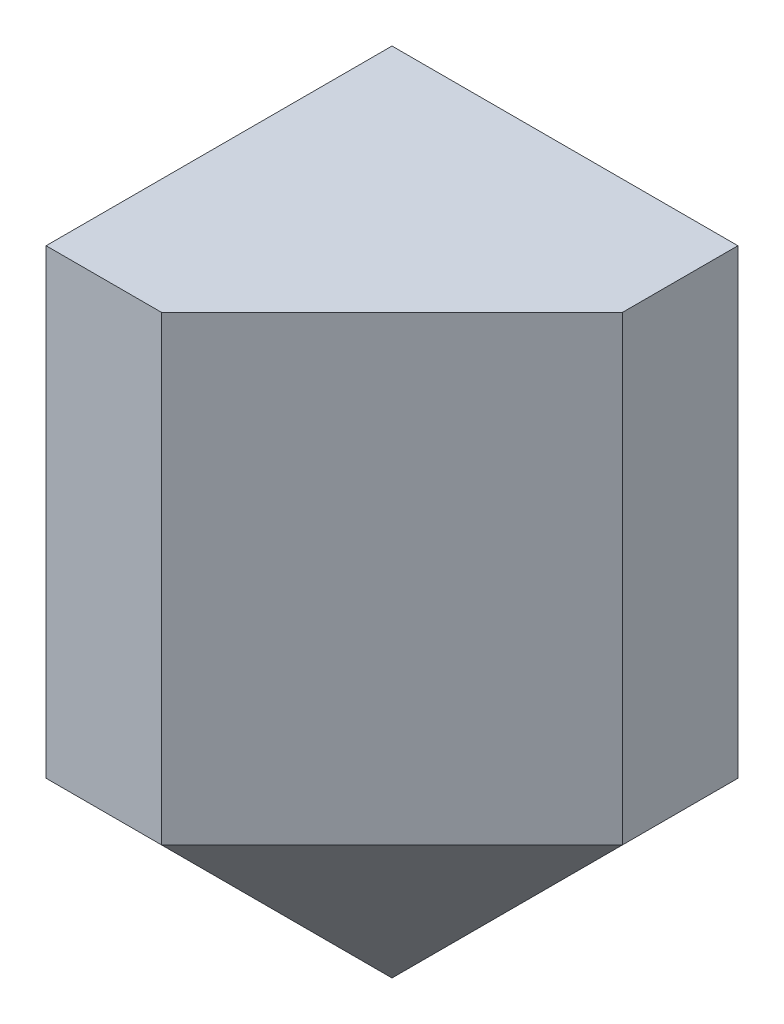
ISO-10303-21;
HEADER;
FILE_DESCRIPTION(('STEP AP214'),'2;1');
FILE_NAME('part.step','',(''),(''),'','','');
FILE_SCHEMA(('AUTOMOTIVE_DESIGN { 1 0 10303 214 1 1 1 1 }'));
ENDSEC;
DATA;
#1=APPLICATION_CONTEXT('core data for automotive mechanical design processes');
#2=APPLICATION_PROTOCOL_DEFINITION('international standard','automotive_design',2000,#1);
#3=PRODUCT_CONTEXT('',#1,'mechanical');
#4=PRODUCT('Part','Part','',(#3));
#5=PRODUCT_RELATED_PRODUCT_CATEGORY('part','',(#4));
#6=PRODUCT_DEFINITION_FORMATION('','',#4);
#7=PRODUCT_DEFINITION_CONTEXT('part definition',#1,'design');
#8=PRODUCT_DEFINITION('design','',#6,#7);
#9=PRODUCT_DEFINITION_SHAPE('','',#8);
#10=(LENGTH_UNIT() NAMED_UNIT(*) SI_UNIT(.MILLI.,.METRE.));
#11=(NAMED_UNIT(*) PLANE_ANGLE_UNIT() SI_UNIT($,.RADIAN.));
#12=(NAMED_UNIT(*) SI_UNIT($,.STERADIAN.) SOLID_ANGLE_UNIT());
#13=UNCERTAINTY_MEASURE_WITH_UNIT(LENGTH_MEASURE(1.E-05),#10,'distance_accuracy_value','');
#14=(GEOMETRIC_REPRESENTATION_CONTEXT(3) GLOBAL_UNCERTAINTY_ASSIGNED_CONTEXT((#13)) GLOBAL_UNIT_ASSIGNED_CONTEXT((#10,
#11,#12)) REPRESENTATION_CONTEXT('',''));
#15=CARTESIAN_POINT('',(0.,0.,0.));
#16=DIRECTION('',(0.,0.,1.));
#17=DIRECTION('',(1.,0.,0.));
#18=AXIS2_PLACEMENT_3D('',#15,#16,#17);
#19=CARTESIAN_POINT('',(0.,0.,30.));
#20=DIRECTION('',(1.,0.,0.));
#21=DIRECTION('',(0.,0.,-1.));
#22=AXIS2_PLACEMENT_3D('',#19,#20,#21);
#23=PLANE('',#22);
#24=CARTESIAN_POINT('',(0.,20.,18.));
#25=DIRECTION('',(-1.,0.,0.));
#26=DIRECTION('',(0.,0.,1.));
#27=AXIS2_PLACEMENT_3D('',#24,#25,#26);
#28=CIRCLE('',#27,2.75);
#29=CARTESIAN_POINT('',(0.,20.,20.75));
#30=VERTEX_POINT('',#29);
#31=EDGE_CURVE('E126',#30,#30,#28,.T.);
#32=ORIENTED_EDGE('',*,*,#31,.F.);
#33=EDGE_LOOP('',(#32));
#34=FACE_BOUND('',#33,.T.);
#35=CARTESIAN_POINT('',(0.,48.,18.));
#36=DIRECTION('',(-1.,0.,0.));
#37=DIRECTION('',(0.,0.,1.));
#38=AXIS2_PLACEMENT_3D('',#35,#36,#37);
#39=CIRCLE('',#38,2.75);
#40=CARTESIAN_POINT('',(0.,48.,20.75));
#41=VERTEX_POINT('',#40);
#42=EDGE_CURVE('E132',#41,#41,#39,.T.);
#43=ORIENTED_EDGE('',*,*,#42,.F.);
#44=EDGE_LOOP('',(#43));
#45=FACE_BOUND('',#44,.T.);
#46=DIRECTION('',(0.,0.,-1.));
#47=VECTOR('',#46,1.);
#48=CARTESIAN_POINT('',(0.,0.,30.));
#49=LINE('',#48,#47);
#50=CARTESIAN_POINT('',(0.,0.,9.99999999999995));
#51=VERTEX_POINT('',#50);
#52=CARTESIAN_POINT('',(0.,0.,0.));
#53=VERTEX_POINT('',#52);
#54=EDGE_CURVE('E157',#51,#53,#49,.T.);
#55=ORIENTED_EDGE('',*,*,#54,.F.);
#56=DIRECTION('',(0.,-0.707106781186546,-0.707106781186549));
#57=VECTOR('',#56,1.);
#58=CARTESIAN_POINT('',(0.,20.,30.));
#59=LINE('',#58,#57);
#60=CARTESIAN_POINT('',(0.,20.,30.));
#61=VERTEX_POINT('',#60);
#62=EDGE_CURVE('E11',#51,#61,#59,.F.);
#63=ORIENTED_EDGE('',*,*,#62,.T.);
#64=DIRECTION('',(0.,-1.,0.));
#65=VECTOR('',#64,1.);
#66=CARTESIAN_POINT('',(0.,0.,30.));
#67=LINE('',#66,#65);
#68=CARTESIAN_POINT('',(0.,60.,30.));
#69=VERTEX_POINT('',#68);
#70=EDGE_CURVE('E154',#69,#61,#67,.T.);
#71=ORIENTED_EDGE('',*,*,#70,.F.);
#72=DIRECTION('',(0.,0.,1.));
#73=VECTOR('',#72,1.);
#74=CARTESIAN_POINT('',(0.,60.,30.));
#75=LINE('',#74,#73);
#76=CARTESIAN_POINT('',(0.,60.,0.));
#77=VERTEX_POINT('',#76);
#78=EDGE_CURVE('E138',#77,#69,#75,.T.);
#79=ORIENTED_EDGE('',*,*,#78,.F.);
#80=DIRECTION('',(0.,-1.,0.));
#81=VECTOR('',#80,1.);
#82=CARTESIAN_POINT('',(0.,0.,0.));
#83=LINE('',#82,#81);
#84=EDGE_CURVE('E159',#77,#53,#83,.T.);
#85=ORIENTED_EDGE('',*,*,#84,.T.);
#86=EDGE_LOOP('',(#55,#63,#71,#79,#85));
#87=FACE_BOUND('',#86,.T.);
#88=ADVANCED_FACE('F39',(#34,#45,#87),#23,.F.);
#89=CARTESIAN_POINT('',(0.,0.,30.));
#90=DIRECTION('',(0.,1.,0.));
#91=DIRECTION('',(0.,0.,1.));
#92=AXIS2_PLACEMENT_3D('',#89,#90,#91);
#93=PLANE('',#92);
#94=DIRECTION('',(1.,0.,0.));
#95=VECTOR('',#94,1.);
#96=CARTESIAN_POINT('',(0.,0.,0.));
#97=LINE('',#96,#95);
#98=CARTESIAN_POINT('',(9.99999999999995,0.,0.));
#99=VERTEX_POINT('',#98);
#100=EDGE_CURVE('E162',#53,#99,#97,.T.);
#101=ORIENTED_EDGE('',*,*,#100,.T.);
#102=DIRECTION('',(0.,0.,1.));
#103=VECTOR('',#102,1.);
#104=CARTESIAN_POINT('',(9.99999999999995,0.,30.));
#105=LINE('',#104,#103);
#106=CARTESIAN_POINT('',(9.99999999999995,0.,9.99999999999995));
#107=VERTEX_POINT('',#106);
#108=EDGE_CURVE('E49',#99,#107,#105,.T.);
#109=ORIENTED_EDGE('',*,*,#108,.T.);
#110=DIRECTION('',(-1.,0.,0.));
#111=VECTOR('',#110,1.);
#112=CARTESIAN_POINT('',(0.,0.,9.99999999999995));
#113=LINE('',#112,#111);
#114=EDGE_CURVE('E60',#107,#51,#113,.T.);
#115=ORIENTED_EDGE('',*,*,#114,.T.);
#116=ORIENTED_EDGE('',*,*,#54,.T.);
#117=EDGE_LOOP('',(#101,#109,#115,#116));
#118=FACE_BOUND('',#117,.T.);
#119=ADVANCED_FACE('F215',(#118),#93,.F.);
#120=CARTESIAN_POINT('',(30.,0.,30.));
#121=DIRECTION('',(-1.,0.,0.));
#122=DIRECTION('',(0.,0.,1.));
#123=AXIS2_PLACEMENT_3D('',#120,#121,#122);
#124=PLANE('',#123);
#125=DIRECTION('',(0.,1.,0.));
#126=VECTOR('',#125,1.);
#127=CARTESIAN_POINT('',(30.,0.,0.));
#128=LINE('',#127,#126);
#129=CARTESIAN_POINT('',(30.,20.,0.));
#130=VERTEX_POINT('',#129);
#131=CARTESIAN_POINT('',(30.,60.,0.));
#132=VERTEX_POINT('',#131);
#133=EDGE_CURVE('E158',#130,#132,#128,.T.);
#134=ORIENTED_EDGE('',*,*,#133,.T.);
#135=DIRECTION('',(0.,0.,-1.));
#136=VECTOR('',#135,1.);
#137=CARTESIAN_POINT('',(30.,60.,0.));
#138=LINE('',#137,#136);
#139=CARTESIAN_POINT('',(30.,60.,9.99999999999992));
#140=VERTEX_POINT('',#139);
#141=EDGE_CURVE('E147',#140,#132,#138,.T.);
#142=ORIENTED_EDGE('',*,*,#141,.F.);
#143=DIRECTION('',(0.,-1.,0.));
#144=VECTOR('',#143,1.);
#145=CARTESIAN_POINT('',(30.,0.,9.99999999999995));
#146=LINE('',#145,#144);
#147=CARTESIAN_POINT('',(30.,20.,9.99999999999995));
#148=VERTEX_POINT('',#147);
#149=EDGE_CURVE('E172',#140,#148,#146,.T.);
#150=ORIENTED_EDGE('',*,*,#149,.T.);
#151=DIRECTION('',(0.,0.,-1.));
#152=VECTOR('',#151,1.);
#153=CARTESIAN_POINT('',(30.,20.,30.));
#154=LINE('',#153,#152);
#155=EDGE_CURVE('E170',#148,#130,#154,.T.);
#156=ORIENTED_EDGE('',*,*,#155,.T.);
#157=EDGE_LOOP('',(#134,#142,#150,#156));
#158=FACE_BOUND('',#157,.T.);
#159=ADVANCED_FACE('F221',(#158),#124,.F.);
#160=CARTESIAN_POINT('',(0.,0.,30.));
#161=DIRECTION('',(0.,0.,-1.));
#162=DIRECTION('',(-1.,0.,0.));
#163=AXIS2_PLACEMENT_3D('',#160,#161,#162);
#164=PLANE('',#163);
#165=DIRECTION('',(1.,0.,0.));
#166=VECTOR('',#165,1.);
#167=CARTESIAN_POINT('',(0.,20.,30.));
#168=LINE('',#167,#166);
#169=CARTESIAN_POINT('',(10.,20.,30.));
#170=VERTEX_POINT('',#169);
#171=EDGE_CURVE('E166',#61,#170,#168,.T.);
#172=ORIENTED_EDGE('',*,*,#171,.T.);
#173=DIRECTION('',(0.,1.,0.));
#174=VECTOR('',#173,1.);
#175=CARTESIAN_POINT('',(10.,0.,30.));
#176=LINE('',#175,#174);
#177=CARTESIAN_POINT('',(9.99999999999999,60.,30.));
#178=VERTEX_POINT('',#177);
#179=EDGE_CURVE('E168',#170,#178,#176,.T.);
#180=ORIENTED_EDGE('',*,*,#179,.T.);
#181=DIRECTION('',(1.,0.,0.));
#182=VECTOR('',#181,1.);
#183=CARTESIAN_POINT('',(9.99999999999999,60.,30.));
#184=LINE('',#183,#182);
#185=EDGE_CURVE('E141',#69,#178,#184,.T.);
#186=ORIENTED_EDGE('',*,*,#185,.F.);
#187=ORIENTED_EDGE('',*,*,#70,.T.);
#188=EDGE_LOOP('',(#172,#180,#186,#187));
#189=FACE_BOUND('',#188,.T.);
#190=ADVANCED_FACE('F195',(#189),#164,.F.);
#191=CARTESIAN_POINT('',(0.,0.,0.));
#192=DIRECTION('',(0.,0.,-1.));
#193=DIRECTION('',(-1.,0.,0.));
#194=AXIS2_PLACEMENT_3D('',#191,#192,#193);
#195=PLANE('',#194);
#196=CARTESIAN_POINT('',(18.,20.,0.));
#197=DIRECTION('',(0.,0.,-1.));
#198=DIRECTION('',(-1.,0.,0.));
#199=AXIS2_PLACEMENT_3D('',#196,#197,#198);
#200=CIRCLE('',#199,2.74999999999999);
#201=CARTESIAN_POINT('',(15.25,20.,0.));
#202=VERTEX_POINT('',#201);
#203=EDGE_CURVE('E116',#202,#202,#200,.T.);
#204=ORIENTED_EDGE('',*,*,#203,.F.);
#205=EDGE_LOOP('',(#204));
#206=FACE_BOUND('',#205,.T.);
#207=CARTESIAN_POINT('',(18.,48.,0.));
#208=DIRECTION('',(0.,0.,-1.));
#209=DIRECTION('',(-1.,0.,0.));
#210=AXIS2_PLACEMENT_3D('',#207,#208,#209);
#211=CIRCLE('',#210,2.74999999999999);
#212=CARTESIAN_POINT('',(15.25,48.,0.));
#213=VERTEX_POINT('',#212);
#214=EDGE_CURVE('E115',#213,#213,#211,.T.);
#215=ORIENTED_EDGE('',*,*,#214,.F.);
#216=EDGE_LOOP('',(#215));
#217=FACE_BOUND('',#216,.T.);
#218=ORIENTED_EDGE('',*,*,#133,.F.);
#219=DIRECTION('',(0.707106781186549,0.707106781186546,0.));
#220=VECTOR('',#219,1.);
#221=CARTESIAN_POINT('',(4.99999999999996,-4.99999999999997,0.));
#222=LINE('',#221,#220);
#223=EDGE_CURVE('E174',#130,#99,#222,.F.);
#224=ORIENTED_EDGE('',*,*,#223,.T.);
#225=ORIENTED_EDGE('',*,*,#100,.F.);
#226=ORIENTED_EDGE('',*,*,#84,.F.);
#227=DIRECTION('',(-1.,0.,0.));
#228=VECTOR('',#227,1.);
#229=CARTESIAN_POINT('',(0.,60.,0.));
#230=LINE('',#229,#228);
#231=EDGE_CURVE('E150',#132,#77,#230,.T.);
#232=ORIENTED_EDGE('',*,*,#231,.F.);
#233=EDGE_LOOP('',(#218,#224,#225,#226,#232));
#234=FACE_BOUND('',#233,.T.);
#235=ADVANCED_FACE('F212',(#206,#217,#234),#195,.T.);
#236=CARTESIAN_POINT('',(30.,20.,30.));
#237=DIRECTION('',(-0.707106781186546,0.707106781186549,0.));
#238=DIRECTION('',(0.,0.,-1.));
#239=AXIS2_PLACEMENT_3D('',#236,#237,#238);
#240=PLANE('',#239);
#241=ORIENTED_EDGE('',*,*,#223,.F.);
#242=ORIENTED_EDGE('',*,*,#155,.F.);
#243=DIRECTION('',(-0.707106781186549,-0.707106781186546,0.));
#244=VECTOR('',#243,1.);
#245=CARTESIAN_POINT('',(30.,20.,9.99999999999995));
#246=LINE('',#245,#244);
#247=EDGE_CURVE('E44',#107,#148,#246,.F.);
#248=ORIENTED_EDGE('',*,*,#247,.F.);
#249=ORIENTED_EDGE('',*,*,#108,.F.);
#250=EDGE_LOOP('',(#241,#242,#248,#249));
#251=FACE_BOUND('',#250,.T.);
#252=ADVANCED_FACE('F42',(#251),#240,.F.);
#253=CARTESIAN_POINT('',(0.,20.,30.));
#254=DIRECTION('',(0.,0.707106781186549,-0.707106781186546));
#255=DIRECTION('',(1.,0.,0.));
#256=AXIS2_PLACEMENT_3D('',#253,#254,#255);
#257=PLANE('',#256);
#258=ORIENTED_EDGE('',*,*,#62,.F.);
#259=ORIENTED_EDGE('',*,*,#114,.F.);
#260=DIRECTION('',(0.,0.707106781186546,0.707106781186549));
#261=VECTOR('',#260,1.);
#262=CARTESIAN_POINT('',(9.99999999999998,10.,20.));
#263=LINE('',#262,#261);
#264=EDGE_CURVE('E179',#170,#107,#263,.F.);
#265=ORIENTED_EDGE('',*,*,#264,.F.);
#266=ORIENTED_EDGE('',*,*,#171,.F.);
#267=EDGE_LOOP('',(#258,#259,#265,#266));
#268=FACE_BOUND('',#267,.T.);
#269=ADVANCED_FACE('F205',(#268),#257,.F.);
#270=CARTESIAN_POINT('',(30.,20.,9.99999999999995));
#271=DIRECTION('',(0.577350269189626,-0.577350269189628,0.577350269189624));
#272=DIRECTION('',(0.707106781186549,0.707106781186546,0.));
#273=AXIS2_PLACEMENT_3D('',#270,#271,#272);
#274=PLANE('',#273);
#275=ORIENTED_EDGE('',*,*,#264,.T.);
#276=ORIENTED_EDGE('',*,*,#247,.T.);
#277=DIRECTION('',(0.707106781186546,0.,-0.707106781186549));
#278=VECTOR('',#277,1.);
#279=CARTESIAN_POINT('',(30.,20.,9.99999999999995));
#280=LINE('',#279,#278);
#281=EDGE_CURVE('E153',#170,#148,#280,.T.);
#282=ORIENTED_EDGE('',*,*,#281,.F.);
#283=EDGE_LOOP('',(#275,#276,#282));
#284=FACE_BOUND('',#283,.T.);
#285=ADVANCED_FACE('F186',(#284),#274,.T.);
#286=CARTESIAN_POINT('',(10.,0.,30.));
#287=DIRECTION('',(-0.707106781186549,0.,-0.707106781186546));
#288=DIRECTION('',(0.,1.,0.));
#289=AXIS2_PLACEMENT_3D('',#286,#287,#288);
#290=PLANE('',#289);
#291=ORIENTED_EDGE('',*,*,#281,.T.);
#292=ORIENTED_EDGE('',*,*,#149,.F.);
#293=DIRECTION('',(0.707106781186546,0.,-0.707106781186549));
#294=VECTOR('',#293,1.);
#295=CARTESIAN_POINT('',(30.,60.,9.99999999999992));
#296=LINE('',#295,#294);
#297=EDGE_CURVE('E144',#178,#140,#296,.T.);
#298=ORIENTED_EDGE('',*,*,#297,.F.);
#299=ORIENTED_EDGE('',*,*,#179,.F.);
#300=EDGE_LOOP('',(#291,#292,#298,#299));
#301=FACE_BOUND('',#300,.T.);
#302=ADVANCED_FACE('F191',(#301),#290,.F.);
#303=CARTESIAN_POINT('',(0.,60.,0.));
#304=DIRECTION('',(0.,-1.,0.));
#305=DIRECTION('',(0.,0.,-1.));
#306=AXIS2_PLACEMENT_3D('',#303,#304,#305);
#307=PLANE('',#306);
#308=ORIENTED_EDGE('',*,*,#78,.T.);
#309=ORIENTED_EDGE('',*,*,#185,.T.);
#310=ORIENTED_EDGE('',*,*,#297,.T.);
#311=ORIENTED_EDGE('',*,*,#141,.T.);
#312=ORIENTED_EDGE('',*,*,#231,.T.);
#313=EDGE_LOOP('',(#308,#309,#310,#311,#312));
#314=FACE_BOUND('',#313,.T.);
#315=ADVANCED_FACE('F198',(#314),#307,.F.);
#316=CARTESIAN_POINT('',(15.,48.,18.));
#317=DIRECTION('',(-1.,0.,0.));
#318=DIRECTION('',(0.,0.,1.));
#319=AXIS2_PLACEMENT_3D('',#316,#317,#318);
#320=CONICAL_SURFACE('',#319,2.74999999999999,1.02974425867665);
#321=CARTESIAN_POINT('',(16.6523667023258,48.,18.));
#322=VERTEX_POINT('',#321);
#323=VERTEX_LOOP('',#322);
#324=FACE_BOUND('',#323,.T.);
#325=CARTESIAN_POINT('',(15.,48.,18.));
#326=DIRECTION('',(-1.,0.,0.));
#327=DIRECTION('',(0.,0.,1.));
#328=AXIS2_PLACEMENT_3D('',#325,#326,#327);
#329=CIRCLE('',#328,2.74999999999999);
#330=CARTESIAN_POINT('',(15.,48.,20.75));
#331=VERTEX_POINT('',#330);
#332=EDGE_CURVE('E135',#331,#331,#329,.T.);
#333=ORIENTED_EDGE('',*,*,#332,.T.);
#334=EDGE_LOOP('',(#333));
#335=FACE_BOUND('',#334,.T.);
#336=ADVANCED_FACE('F241',(#324,#335),#320,.F.);
#337=CARTESIAN_POINT('',(0.,48.,18.));
#338=DIRECTION('',(-1.,0.,0.));
#339=DIRECTION('',(0.,0.,1.));
#340=AXIS2_PLACEMENT_3D('',#337,#338,#339);
#341=CYLINDRICAL_SURFACE('',#340,2.74999999999999);
#342=ORIENTED_EDGE('',*,*,#332,.F.);
#343=EDGE_LOOP('',(#342));
#344=FACE_BOUND('',#343,.T.);
#345=ORIENTED_EDGE('',*,*,#42,.T.);
#346=EDGE_LOOP('',(#345));
#347=FACE_BOUND('',#346,.T.);
#348=ADVANCED_FACE('F246',(#344,#347),#341,.F.);
#349=CARTESIAN_POINT('',(15.,20.,18.));
#350=DIRECTION('',(-1.,0.,0.));
#351=DIRECTION('',(0.,0.,1.));
#352=AXIS2_PLACEMENT_3D('',#349,#350,#351);
#353=CONICAL_SURFACE('',#352,2.74999999999999,1.02974425867665);
#354=CARTESIAN_POINT('',(16.6523667023258,20.,18.));
#355=VERTEX_POINT('',#354);
#356=VERTEX_LOOP('',#355);
#357=FACE_BOUND('',#356,.T.);
#358=CARTESIAN_POINT('',(15.,20.,18.));
#359=DIRECTION('',(-1.,0.,0.));
#360=DIRECTION('',(0.,0.,1.));
#361=AXIS2_PLACEMENT_3D('',#358,#359,#360);
#362=CIRCLE('',#361,2.74999999999999);
#363=CARTESIAN_POINT('',(15.,20.,20.75));
#364=VERTEX_POINT('',#363);
#365=EDGE_CURVE('E129',#364,#364,#362,.T.);
#366=ORIENTED_EDGE('',*,*,#365,.T.);
#367=EDGE_LOOP('',(#366));
#368=FACE_BOUND('',#367,.T.);
#369=ADVANCED_FACE('F358',(#357,#368),#353,.F.);
#370=CARTESIAN_POINT('',(0.,20.,18.));
#371=DIRECTION('',(-1.,0.,0.));
#372=DIRECTION('',(0.,0.,1.));
#373=AXIS2_PLACEMENT_3D('',#370,#371,#372);
#374=CYLINDRICAL_SURFACE('',#373,2.74999999999999);
#375=ORIENTED_EDGE('',*,*,#365,.F.);
#376=EDGE_LOOP('',(#375));
#377=FACE_BOUND('',#376,.T.);
#378=ORIENTED_EDGE('',*,*,#31,.T.);
#379=EDGE_LOOP('',(#378));
#380=FACE_BOUND('',#379,.T.);
#381=ADVANCED_FACE('F367',(#377,#380),#374,.F.);
#382=CARTESIAN_POINT('',(18.,48.,15.));
#383=DIRECTION('',(0.,0.,-1.));
#384=DIRECTION('',(-1.,0.,0.));
#385=AXIS2_PLACEMENT_3D('',#382,#383,#384);
#386=CONICAL_SURFACE('',#385,2.74999999999999,1.02974425867665);
#387=CARTESIAN_POINT('',(18.,48.,16.6523667023258));
#388=VERTEX_POINT('',#387);
#389=VERTEX_LOOP('',#388);
#390=FACE_BOUND('',#389,.T.);
#391=CARTESIAN_POINT('',(18.,48.,15.));
#392=DIRECTION('',(0.,0.,-1.));
#393=DIRECTION('',(-1.,0.,0.));
#394=AXIS2_PLACEMENT_3D('',#391,#392,#393);
#395=CIRCLE('',#394,2.74999999999999);
#396=CARTESIAN_POINT('',(15.25,48.,15.));
#397=VERTEX_POINT('',#396);
#398=EDGE_CURVE('E119',#397,#397,#395,.T.);
#399=ORIENTED_EDGE('',*,*,#398,.T.);
#400=EDGE_LOOP('',(#399));
#401=FACE_BOUND('',#400,.T.);
#402=ADVANCED_FACE('F377',(#390,#401),#386,.F.);
#403=CARTESIAN_POINT('',(18.,48.,0.));
#404=DIRECTION('',(0.,0.,-1.));
#405=DIRECTION('',(-1.,0.,0.));
#406=AXIS2_PLACEMENT_3D('',#403,#404,#405);
#407=CYLINDRICAL_SURFACE('',#406,2.74999999999999);
#408=ORIENTED_EDGE('',*,*,#398,.F.);
#409=EDGE_LOOP('',(#408));
#410=FACE_BOUND('',#409,.T.);
#411=ORIENTED_EDGE('',*,*,#214,.T.);
#412=EDGE_LOOP('',(#411));
#413=FACE_BOUND('',#412,.T.);
#414=ADVANCED_FACE('F109',(#410,#413),#407,.F.);
#415=CARTESIAN_POINT('',(18.,20.,15.));
#416=DIRECTION('',(0.,0.,-1.));
#417=DIRECTION('',(-1.,0.,0.));
#418=AXIS2_PLACEMENT_3D('',#415,#416,#417);
#419=CONICAL_SURFACE('',#418,2.74999999999999,1.02974425867665);
#420=CARTESIAN_POINT('',(18.,20.,16.6523667023258));
#421=VERTEX_POINT('',#420);
#422=VERTEX_LOOP('',#421);
#423=FACE_BOUND('',#422,.T.);
#424=CARTESIAN_POINT('',(18.,20.,15.));
#425=DIRECTION('',(0.,0.,-1.));
#426=DIRECTION('',(-1.,0.,0.));
#427=AXIS2_PLACEMENT_3D('',#424,#425,#426);
#428=CIRCLE('',#427,2.74999999999999);
#429=CARTESIAN_POINT('',(15.25,20.,15.));
#430=VERTEX_POINT('',#429);
#431=EDGE_CURVE('E113',#430,#430,#428,.T.);
#432=ORIENTED_EDGE('',*,*,#431,.T.);
#433=EDGE_LOOP('',(#432));
#434=FACE_BOUND('',#433,.T.);
#435=ADVANCED_FACE('F105',(#423,#434),#419,.F.);
#436=CARTESIAN_POINT('',(18.,20.,0.));
#437=DIRECTION('',(0.,0.,-1.));
#438=DIRECTION('',(-1.,0.,0.));
#439=AXIS2_PLACEMENT_3D('',#436,#437,#438);
#440=CYLINDRICAL_SURFACE('',#439,2.74999999999999);
#441=ORIENTED_EDGE('',*,*,#431,.F.);
#442=EDGE_LOOP('',(#441));
#443=FACE_BOUND('',#442,.T.);
#444=ORIENTED_EDGE('',*,*,#203,.T.);
#445=EDGE_LOOP('',(#444));
#446=FACE_BOUND('',#445,.T.);
#447=ADVANCED_FACE('F108',(#443,#446),#440,.F.);
#448=CLOSED_SHELL('',(#88,#119,#159,#190,#235,#252,#269,#285,#302,#315,#336,#348,#369,#381,#402,
#414,#435,#447));
#449=MANIFOLD_SOLID_BREP('B2',#448);
#450=ADVANCED_BREP_SHAPE_REPRESENTATION('',(#18,#449),#14);
#451=SHAPE_DEFINITION_REPRESENTATION(#9,#450);
ENDSEC;
END-ISO-10303-21;
